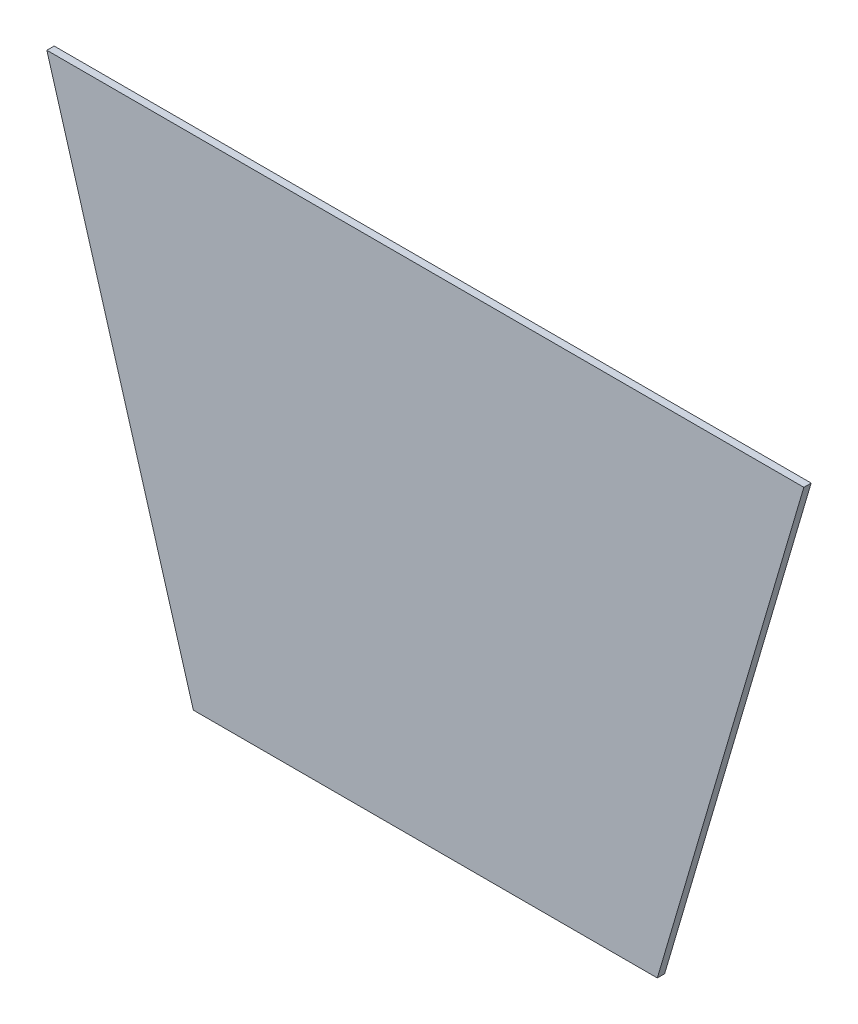
ISO-10303-21;
HEADER;
FILE_DESCRIPTION(('STEP AP214'),'2;1');
FILE_NAME('part.step','',(''),(''),'','','');
FILE_SCHEMA(('AUTOMOTIVE_DESIGN { 1 0 10303 214 1 1 1 1 }'));
ENDSEC;
DATA;
#1=APPLICATION_CONTEXT('core data for automotive mechanical design processes');
#2=APPLICATION_PROTOCOL_DEFINITION('international standard','automotive_design',2000,#1);
#3=PRODUCT_CONTEXT('',#1,'mechanical');
#4=PRODUCT('Part','Part','',(#3));
#5=PRODUCT_RELATED_PRODUCT_CATEGORY('part','',(#4));
#6=PRODUCT_DEFINITION_FORMATION('','',#4);
#7=PRODUCT_DEFINITION_CONTEXT('part definition',#1,'design');
#8=PRODUCT_DEFINITION('design','',#6,#7);
#9=PRODUCT_DEFINITION_SHAPE('','',#8);
#10=(LENGTH_UNIT() NAMED_UNIT(*) SI_UNIT(.MILLI.,.METRE.));
#11=(NAMED_UNIT(*) PLANE_ANGLE_UNIT() SI_UNIT($,.RADIAN.));
#12=(NAMED_UNIT(*) SI_UNIT($,.STERADIAN.) SOLID_ANGLE_UNIT());
#13=UNCERTAINTY_MEASURE_WITH_UNIT(LENGTH_MEASURE(1.E-05),#10,'distance_accuracy_value','');
#14=(GEOMETRIC_REPRESENTATION_CONTEXT(3) GLOBAL_UNCERTAINTY_ASSIGNED_CONTEXT((#13)) GLOBAL_UNIT_ASSIGNED_CONTEXT((#10,
#11,#12)) REPRESENTATION_CONTEXT('',''));
#15=CARTESIAN_POINT('',(0.,0.,0.));
#16=DIRECTION('',(0.,0.,1.));
#17=DIRECTION('',(1.,0.,0.));
#18=AXIS2_PLACEMENT_3D('',#15,#16,#17);
#19=CARTESIAN_POINT('',(-164.0205,0.,-3.175));
#20=DIRECTION('',(-0.959365501571271,-0.28216632399155,0.));
#21=DIRECTION('',(0.28216632399155,-0.959365501571271,0.));
#22=AXIS2_PLACEMENT_3D('',#19,#20,#21);
#23=PLANE('',#22);
#24=DIRECTION('',(0.28216632399155,-0.959365501571271,0.));
#25=VECTOR('',#24,1.);
#26=CARTESIAN_POINT('',(-164.0205,0.,0.));
#27=LINE('',#26,#25);
#28=CARTESIAN_POINT('',(-164.0205,0.,0.));
#29=VERTEX_POINT('',#28);
#30=CARTESIAN_POINT('',(-100.5205,-215.9,0.));
#31=VERTEX_POINT('',#30);
#32=EDGE_CURVE('E117',#29,#31,#27,.T.);
#33=ORIENTED_EDGE('',*,*,#32,.F.);
#34=DIRECTION('',(0.,0.,1.));
#35=VECTOR('',#34,1.);
#36=CARTESIAN_POINT('',(-164.0205,0.,-3.175));
#37=LINE('',#36,#35);
#38=CARTESIAN_POINT('',(-164.0205,0.,-3.175));
#39=VERTEX_POINT('',#38);
#40=EDGE_CURVE('E11',#39,#29,#37,.T.);
#41=ORIENTED_EDGE('',*,*,#40,.F.);
#42=DIRECTION('',(0.28216632399155,-0.959365501571271,0.));
#43=VECTOR('',#42,1.);
#44=CARTESIAN_POINT('',(-164.0205,0.,-3.175));
#45=LINE('',#44,#43);
#46=CARTESIAN_POINT('',(-100.5205,-215.9,-3.175));
#47=VERTEX_POINT('',#46);
#48=EDGE_CURVE('E109',#39,#47,#45,.T.);
#49=ORIENTED_EDGE('',*,*,#48,.T.);
#50=DIRECTION('',(0.,0.,1.));
#51=VECTOR('',#50,1.);
#52=CARTESIAN_POINT('',(-100.5205,-215.9,-3.175));
#53=LINE('',#52,#51);
#54=EDGE_CURVE('E50',#47,#31,#53,.T.);
#55=ORIENTED_EDGE('',*,*,#54,.T.);
#56=EDGE_LOOP('',(#33,#41,#49,#55));
#57=FACE_BOUND('',#56,.T.);
#58=ADVANCED_FACE('F47',(#57),#23,.T.);
#59=CARTESIAN_POINT('',(-164.0205,0.,-3.175));
#60=DIRECTION('',(0.,1.,0.));
#61=DIRECTION('',(-1.,0.,0.));
#62=AXIS2_PLACEMENT_3D('',#59,#60,#61);
#63=PLANE('',#62);
#64=DIRECTION('',(-1.,0.,0.));
#65=VECTOR('',#64,1.);
#66=CARTESIAN_POINT('',(-164.0205,0.,0.));
#67=LINE('',#66,#65);
#68=CARTESIAN_POINT('',(164.0205,0.,0.));
#69=VERTEX_POINT('',#68);
#70=EDGE_CURVE('E112',#69,#29,#67,.T.);
#71=ORIENTED_EDGE('',*,*,#70,.F.);
#72=DIRECTION('',(0.,0.,1.));
#73=VECTOR('',#72,1.);
#74=CARTESIAN_POINT('',(164.0205,0.,-3.175));
#75=LINE('',#74,#73);
#76=CARTESIAN_POINT('',(164.0205,0.,-3.175));
#77=VERTEX_POINT('',#76);
#78=EDGE_CURVE('E57',#77,#69,#75,.T.);
#79=ORIENTED_EDGE('',*,*,#78,.F.);
#80=DIRECTION('',(-1.,0.,0.));
#81=VECTOR('',#80,1.);
#82=CARTESIAN_POINT('',(-164.0205,0.,-3.175));
#83=LINE('',#82,#81);
#84=EDGE_CURVE('E104',#77,#39,#83,.T.);
#85=ORIENTED_EDGE('',*,*,#84,.T.);
#86=ORIENTED_EDGE('',*,*,#40,.T.);
#87=EDGE_LOOP('',(#71,#79,#85,#86));
#88=FACE_BOUND('',#87,.T.);
#89=ADVANCED_FACE('F133',(#88),#63,.T.);
#90=CARTESIAN_POINT('',(164.0205,0.,-3.175));
#91=DIRECTION('',(0.959365501571271,-0.28216632399155,0.));
#92=DIRECTION('',(0.28216632399155,0.959365501571271,0.));
#93=AXIS2_PLACEMENT_3D('',#90,#91,#92);
#94=PLANE('',#93);
#95=DIRECTION('',(0.28216632399155,0.959365501571271,0.));
#96=VECTOR('',#95,1.);
#97=CARTESIAN_POINT('',(164.0205,0.,0.));
#98=LINE('',#97,#96);
#99=CARTESIAN_POINT('',(100.5205,-215.9,0.));
#100=VERTEX_POINT('',#99);
#101=EDGE_CURVE('E98',#100,#69,#98,.T.);
#102=ORIENTED_EDGE('',*,*,#101,.F.);
#103=DIRECTION('',(0.,0.,1.));
#104=VECTOR('',#103,1.);
#105=CARTESIAN_POINT('',(100.5205,-215.9,-3.175));
#106=LINE('',#105,#104);
#107=CARTESIAN_POINT('',(100.5205,-215.9,-3.175));
#108=VERTEX_POINT('',#107);
#109=EDGE_CURVE('E93',#108,#100,#106,.T.);
#110=ORIENTED_EDGE('',*,*,#109,.F.);
#111=DIRECTION('',(0.28216632399155,0.959365501571271,0.));
#112=VECTOR('',#111,1.);
#113=CARTESIAN_POINT('',(164.0205,0.,-3.175));
#114=LINE('',#113,#112);
#115=EDGE_CURVE('E96',#108,#77,#114,.T.);
#116=ORIENTED_EDGE('',*,*,#115,.T.);
#117=ORIENTED_EDGE('',*,*,#78,.T.);
#118=EDGE_LOOP('',(#102,#110,#116,#117));
#119=FACE_BOUND('',#118,.T.);
#120=ADVANCED_FACE('F95',(#119),#94,.T.);
#121=CARTESIAN_POINT('',(-100.5205,-215.9,-3.175));
#122=DIRECTION('',(0.,-1.,0.));
#123=DIRECTION('',(0.,0.,-1.));
#124=AXIS2_PLACEMENT_3D('',#121,#122,#123);
#125=PLANE('',#124);
#126=DIRECTION('',(1.,0.,0.));
#127=VECTOR('',#126,1.);
#128=CARTESIAN_POINT('',(-100.5205,-215.9,0.));
#129=LINE('',#128,#127);
#130=EDGE_CURVE('E121',#31,#100,#129,.T.);
#131=ORIENTED_EDGE('',*,*,#130,.F.);
#132=ORIENTED_EDGE('',*,*,#54,.F.);
#133=DIRECTION('',(1.,0.,0.));
#134=VECTOR('',#133,1.);
#135=CARTESIAN_POINT('',(-100.5205,-215.9,-3.175));
#136=LINE('',#135,#134);
#137=EDGE_CURVE('E103',#47,#108,#136,.T.);
#138=ORIENTED_EDGE('',*,*,#137,.T.);
#139=ORIENTED_EDGE('',*,*,#109,.T.);
#140=EDGE_LOOP('',(#131,#132,#138,#139));
#141=FACE_BOUND('',#140,.T.);
#142=ADVANCED_FACE('F107',(#141),#125,.T.);
#143=CARTESIAN_POINT('',(0.,0.,-3.175));
#144=DIRECTION('',(0.,0.,1.));
#145=DIRECTION('',(1.,0.,0.));
#146=AXIS2_PLACEMENT_3D('',#143,#144,#145);
#147=PLANE('',#146);
#148=ORIENTED_EDGE('',*,*,#48,.F.);
#149=ORIENTED_EDGE('',*,*,#84,.F.);
#150=ORIENTED_EDGE('',*,*,#115,.F.);
#151=ORIENTED_EDGE('',*,*,#137,.F.);
#152=EDGE_LOOP('',(#148,#149,#150,#151));
#153=FACE_BOUND('',#152,.T.);
#154=ADVANCED_FACE('F102',(#153),#147,.F.);
#155=CARTESIAN_POINT('',(0.,0.,0.));
#156=DIRECTION('',(0.,0.,1.));
#157=DIRECTION('',(1.,0.,0.));
#158=AXIS2_PLACEMENT_3D('',#155,#156,#157);
#159=PLANE('',#158);
#160=ORIENTED_EDGE('',*,*,#32,.T.);
#161=ORIENTED_EDGE('',*,*,#130,.T.);
#162=ORIENTED_EDGE('',*,*,#101,.T.);
#163=ORIENTED_EDGE('',*,*,#70,.T.);
#164=EDGE_LOOP('',(#160,#161,#162,#163));
#165=FACE_BOUND('',#164,.T.);
#166=ADVANCED_FACE('F132',(#165),#159,.T.);
#167=CLOSED_SHELL('',(#58,#89,#120,#142,#154,#166));
#168=MANIFOLD_SOLID_BREP('B2',#167);
#169=ADVANCED_BREP_SHAPE_REPRESENTATION('',(#18,#168),#14);
#170=SHAPE_DEFINITION_REPRESENTATION(#9,#169);
ENDSEC;
END-ISO-10303-21;
